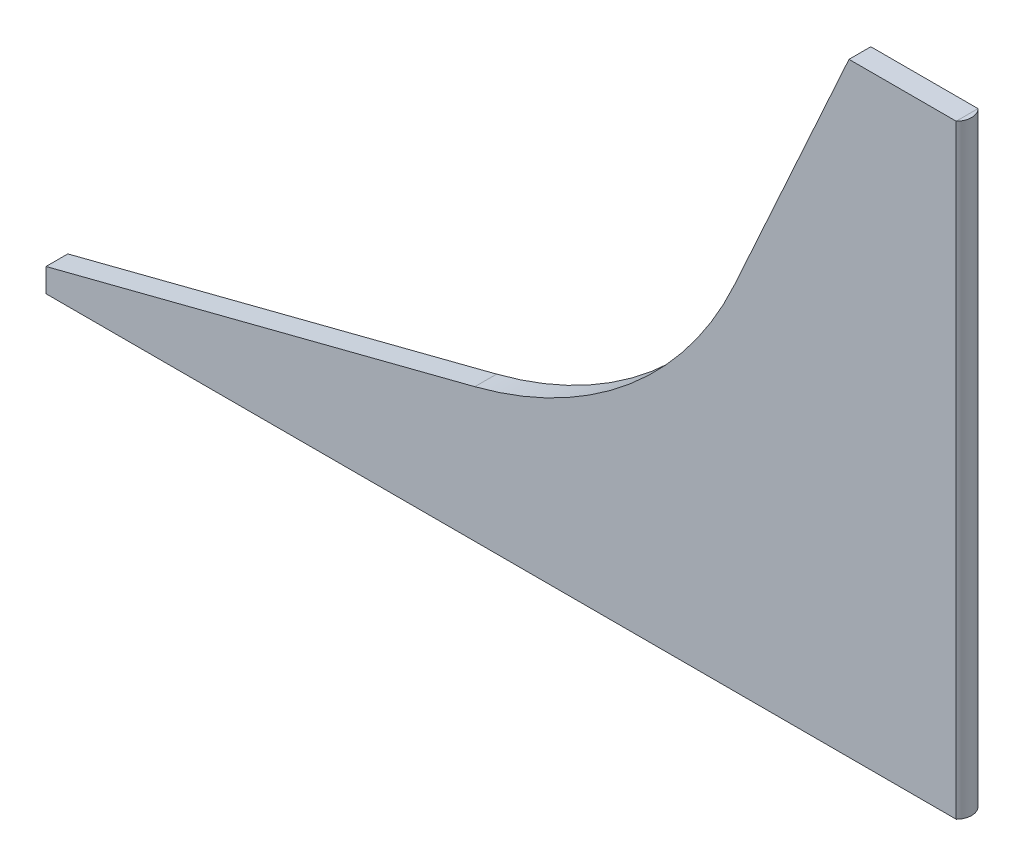
ISO-10303-21;
HEADER;
FILE_DESCRIPTION(('STEP AP214'),'2;1');
FILE_NAME('part.step','',(''),(''),'','','');
FILE_SCHEMA(('AUTOMOTIVE_DESIGN { 1 0 10303 214 1 1 1 1 }'));
ENDSEC;
DATA;
#1=APPLICATION_CONTEXT('core data for automotive mechanical design processes');
#2=APPLICATION_PROTOCOL_DEFINITION('international standard','automotive_design',2000,#1);
#3=PRODUCT_CONTEXT('',#1,'mechanical');
#4=PRODUCT('Part','Part','',(#3));
#5=PRODUCT_RELATED_PRODUCT_CATEGORY('part','',(#4));
#6=PRODUCT_DEFINITION_FORMATION('','',#4);
#7=PRODUCT_DEFINITION_CONTEXT('part definition',#1,'design');
#8=PRODUCT_DEFINITION('design','',#6,#7);
#9=PRODUCT_DEFINITION_SHAPE('','',#8);
#10=(LENGTH_UNIT() NAMED_UNIT(*) SI_UNIT(.MILLI.,.METRE.));
#11=(NAMED_UNIT(*) PLANE_ANGLE_UNIT() SI_UNIT($,.RADIAN.));
#12=(NAMED_UNIT(*) SI_UNIT($,.STERADIAN.) SOLID_ANGLE_UNIT());
#13=UNCERTAINTY_MEASURE_WITH_UNIT(LENGTH_MEASURE(1.E-05),#10,'distance_accuracy_value','');
#14=(GEOMETRIC_REPRESENTATION_CONTEXT(3) GLOBAL_UNCERTAINTY_ASSIGNED_CONTEXT((#13)) GLOBAL_UNIT_ASSIGNED_CONTEXT((#10,
#11,#12)) REPRESENTATION_CONTEXT('',''));
#15=CARTESIAN_POINT('',(0.,0.,0.));
#16=DIRECTION('',(0.,0.,1.));
#17=DIRECTION('',(1.,0.,0.));
#18=AXIS2_PLACEMENT_3D('',#15,#16,#17);
#19=CARTESIAN_POINT('',(316.193910951218,303.526867896713,7.5));
#20=DIRECTION('',(0.,-1.,0.));
#21=DIRECTION('',(0.,0.,-1.));
#22=AXIS2_PLACEMENT_3D('',#19,#20,#21);
#23=CYLINDRICAL_SURFACE('',#22,6.36396103067901);
#24=DIRECTION('',(0.,-1.,0.));
#25=VECTOR('',#24,1.);
#26=CARTESIAN_POINT('',(320.693910951218,303.526867896713,12.));
#27=LINE('',#26,#25);
#28=CARTESIAN_POINT('',(320.693910951218,303.526867896713,12.));
#29=VERTEX_POINT('',#28);
#30=CARTESIAN_POINT('',(320.693910951218,53.9268678967132,12.));
#31=VERTEX_POINT('',#30);
#32=EDGE_CURVE('E59',#29,#31,#27,.T.);
#33=ORIENTED_EDGE('',*,*,#32,.T.);
#34=CARTESIAN_POINT('',(316.193910951218,53.9268678967132,7.5));
#35=DIRECTION('',(0.,1.,0.));
#36=DIRECTION('',(0.,0.,-1.));
#37=AXIS2_PLACEMENT_3D('',#34,#35,#36);
#38=CIRCLE('',#37,6.36396103067901);
#39=CARTESIAN_POINT('',(320.693910951218,53.9268678967132,3.));
#40=VERTEX_POINT('',#39);
#41=EDGE_CURVE('E82',#31,#40,#38,.T.);
#42=ORIENTED_EDGE('',*,*,#41,.T.);
#43=DIRECTION('',(0.,-1.,0.));
#44=VECTOR('',#43,1.);
#45=CARTESIAN_POINT('',(320.693910951218,303.526867896713,3.));
#46=LINE('',#45,#44);
#47=CARTESIAN_POINT('',(320.693910951218,303.526867896713,3.));
#48=VERTEX_POINT('',#47);
#49=EDGE_CURVE('E12',#48,#40,#46,.T.);
#50=ORIENTED_EDGE('',*,*,#49,.F.);
#51=CARTESIAN_POINT('',(316.193910951218,303.526867896713,7.5));
#52=DIRECTION('',(0.,1.,0.));
#53=DIRECTION('',(0.,0.,-1.));
#54=AXIS2_PLACEMENT_3D('',#51,#52,#53);
#55=CIRCLE('',#54,6.36396103067901);
#56=EDGE_CURVE('E88',#29,#48,#55,.T.);
#57=ORIENTED_EDGE('',*,*,#56,.F.);
#58=EDGE_LOOP('',(#33,#42,#50,#57));
#59=FACE_BOUND('',#58,.T.);
#60=ADVANCED_FACE('F51',(#59),#23,.T.);
#61=CARTESIAN_POINT('',(320.693910951218,303.526867896713,3.));
#62=DIRECTION('',(1.,0.,0.));
#63=DIRECTION('',(0.,0.,-1.));
#64=AXIS2_PLACEMENT_3D('',#61,#62,#63);
#65=PLANE('',#64);
#66=ORIENTED_EDGE('',*,*,#49,.T.);
#67=DIRECTION('',(0.,0.,1.));
#68=VECTOR('',#67,1.);
#69=CARTESIAN_POINT('',(320.693910951218,53.9268678967132,3.));
#70=LINE('',#69,#68);
#71=EDGE_CURVE('E78',#40,#31,#70,.T.);
#72=ORIENTED_EDGE('',*,*,#71,.T.);
#73=ORIENTED_EDGE('',*,*,#32,.F.);
#74=DIRECTION('',(0.,0.,1.));
#75=VECTOR('',#74,1.);
#76=CARTESIAN_POINT('',(320.693910951218,303.526867896713,3.));
#77=LINE('',#76,#75);
#78=EDGE_CURVE('E65',#48,#29,#77,.T.);
#79=ORIENTED_EDGE('',*,*,#78,.F.);
#80=EDGE_LOOP('',(#66,#72,#73,#79));
#81=FACE_BOUND('',#80,.T.);
#82=ADVANCED_FACE('F76',(#81),#65,.F.);
#83=CARTESIAN_POINT('',(316.193910951218,303.526867896713,7.5));
#84=DIRECTION('',(0.,-1.,0.));
#85=DIRECTION('',(0.,0.,-1.));
#86=AXIS2_PLACEMENT_3D('',#83,#84,#85);
#87=PLANE('',#86);
#88=ORIENTED_EDGE('',*,*,#56,.T.);
#89=ORIENTED_EDGE('',*,*,#78,.T.);
#90=EDGE_LOOP('',(#88,#89));
#91=FACE_BOUND('',#90,.T.);
#92=ADVANCED_FACE('F95',(#91),#87,.F.);
#93=CARTESIAN_POINT('',(316.193910951218,53.9268678967132,7.5));
#94=DIRECTION('',(0.,-1.,0.));
#95=DIRECTION('',(0.,0.,-1.));
#96=AXIS2_PLACEMENT_3D('',#93,#94,#95);
#97=PLANE('',#96);
#98=ORIENTED_EDGE('',*,*,#41,.F.);
#99=ORIENTED_EDGE('',*,*,#71,.F.);
#100=EDGE_LOOP('',(#98,#99));
#101=FACE_BOUND('',#100,.T.);
#102=ADVANCED_FACE('F86',(#101),#97,.T.);
#103=CLOSED_SHELL('',(#60,#82,#92,#102));
#104=MANIFOLD_SOLID_BREP('B2',#103);
#105=CARTESIAN_POINT('',(320.693910951217,53.9268678967132,12.));
#106=DIRECTION('',(-1.,0.,0.));
#107=DIRECTION('',(0.,-1.,0.));
#108=AXIS2_PLACEMENT_3D('',#105,#106,#107);
#109=PLANE('',#108);
#110=DIRECTION('',(0.,1.,0.));
#111=VECTOR('',#110,1.);
#112=CARTESIAN_POINT('',(320.693910951217,53.9268678967132,3.));
#113=LINE('',#112,#111);
#114=CARTESIAN_POINT('',(320.693910951217,53.9268678967132,3.));
#115=VERTEX_POINT('',#114);
#116=CARTESIAN_POINT('',(320.693910951218,303.526867896713,3.));
#117=VERTEX_POINT('',#116);
#118=EDGE_CURVE('E227',#115,#117,#113,.T.);
#119=ORIENTED_EDGE('',*,*,#118,.T.);
#120=DIRECTION('',(0.,0.,-1.));
#121=VECTOR('',#120,1.);
#122=CARTESIAN_POINT('',(320.693910951218,303.526867896713,12.));
#123=LINE('',#122,#121);
#124=CARTESIAN_POINT('',(320.693910951218,303.526867896713,12.));
#125=VERTEX_POINT('',#124);
#126=EDGE_CURVE('E141',#125,#117,#123,.T.);
#127=ORIENTED_EDGE('',*,*,#126,.F.);
#128=DIRECTION('',(0.,1.,0.));
#129=VECTOR('',#128,1.);
#130=CARTESIAN_POINT('',(320.693910951217,53.9268678967132,12.));
#131=LINE('',#130,#129);
#132=CARTESIAN_POINT('',(320.693910951217,53.9268678967132,12.));
#133=VERTEX_POINT('',#132);
#134=EDGE_CURVE('E190',#133,#125,#131,.T.);
#135=ORIENTED_EDGE('',*,*,#134,.F.);
#136=DIRECTION('',(0.,0.,-1.));
#137=VECTOR('',#136,1.);
#138=CARTESIAN_POINT('',(320.693910951217,53.9268678967132,12.));
#139=LINE('',#138,#137);
#140=EDGE_CURVE('E49',#133,#115,#139,.T.);
#141=ORIENTED_EDGE('',*,*,#140,.T.);
#142=EDGE_LOOP('',(#119,#127,#135,#141));
#143=FACE_BOUND('',#142,.T.);
#144=ADVANCED_FACE('F133',(#143),#109,.F.);
#145=CARTESIAN_POINT('',(320.693910951218,303.526867896713,12.));
#146=DIRECTION('',(0.,-1.,0.));
#147=DIRECTION('',(0.,0.,-1.));
#148=AXIS2_PLACEMENT_3D('',#145,#146,#147);
#149=PLANE('',#148);
#150=DIRECTION('',(-1.,0.,0.));
#151=VECTOR('',#150,1.);
#152=CARTESIAN_POINT('',(320.693910951218,303.526867896713,3.));
#153=LINE('',#152,#151);
#154=CARTESIAN_POINT('',(276.442443442337,303.526867896713,3.));
#155=VERTEX_POINT('',#154);
#156=EDGE_CURVE('E229',#117,#155,#153,.T.);
#157=ORIENTED_EDGE('',*,*,#156,.T.);
#158=DIRECTION('',(0.,0.,-1.));
#159=VECTOR('',#158,1.);
#160=CARTESIAN_POINT('',(276.442443442337,303.526867896713,12.));
#161=LINE('',#160,#159);
#162=CARTESIAN_POINT('',(276.442443442337,303.526867896713,12.));
#163=VERTEX_POINT('',#162);
#164=EDGE_CURVE('E241',#163,#155,#161,.T.);
#165=ORIENTED_EDGE('',*,*,#164,.F.);
#166=DIRECTION('',(-1.,0.,0.));
#167=VECTOR('',#166,1.);
#168=CARTESIAN_POINT('',(320.693910951218,303.526867896713,12.));
#169=LINE('',#168,#167);
#170=EDGE_CURVE('E249',#125,#163,#169,.T.);
#171=ORIENTED_EDGE('',*,*,#170,.F.);
#172=ORIENTED_EDGE('',*,*,#126,.T.);
#173=EDGE_LOOP('',(#157,#165,#171,#172));
#174=FACE_BOUND('',#173,.T.);
#175=ADVANCED_FACE('F247',(#174),#149,.F.);
#176=CARTESIAN_POINT('',(276.442443442337,303.526867896713,12.));
#177=DIRECTION('',(0.910712499489341,-0.413040849400973,0.));
#178=DIRECTION('',(0.413040849400973,0.910712499489341,0.));
#179=AXIS2_PLACEMENT_3D('',#176,#177,#178);
#180=PLANE('',#179);
#181=DIRECTION('',(-0.413040849400973,-0.910712499489341,0.));
#182=VECTOR('',#181,1.);
#183=CARTESIAN_POINT('',(276.442443442337,303.526867896713,3.));
#184=LINE('',#183,#182);
#185=CARTESIAN_POINT('',(229.13261141598,199.213564654115,3.));
#186=VERTEX_POINT('',#185);
#187=EDGE_CURVE('E231',#155,#186,#184,.T.);
#188=ORIENTED_EDGE('',*,*,#187,.T.);
#189=DIRECTION('',(0.,0.,-1.));
#190=VECTOR('',#189,1.);
#191=CARTESIAN_POINT('',(229.13261141598,199.213564654115,12.));
#192=LINE('',#191,#190);
#193=CARTESIAN_POINT('',(229.13261141598,199.213564654115,12.));
#194=VERTEX_POINT('',#193);
#195=EDGE_CURVE('E216',#194,#186,#192,.T.);
#196=ORIENTED_EDGE('',*,*,#195,.F.);
#197=DIRECTION('',(-0.413040849400973,-0.910712499489341,0.));
#198=VECTOR('',#197,1.);
#199=CARTESIAN_POINT('',(276.442443442337,303.526867896713,12.));
#200=LINE('',#199,#198);
#201=EDGE_CURVE('E207',#163,#194,#200,.T.);
#202=ORIENTED_EDGE('',*,*,#201,.F.);
#203=ORIENTED_EDGE('',*,*,#164,.T.);
#204=EDGE_LOOP('',(#188,#196,#202,#203));
#205=FACE_BOUND('',#204,.T.);
#206=ADVANCED_FACE('F256',(#205),#180,.F.);
#207=CARTESIAN_POINT('',(81.5971864987071,266.126182257072,12.));
#208=DIRECTION('',(0.,0.,-1.));
#209=DIRECTION('',(-1.,0.,0.));
#210=AXIS2_PLACEMENT_3D('',#207,#208,#209);
#211=CYLINDRICAL_SURFACE('',#210,162.);
#212=CARTESIAN_POINT('',(81.5971864987071,266.126182257072,3.));
#213=DIRECTION('',(0.,0.,-1.));
#214=DIRECTION('',(-1.,0.,0.));
#215=AXIS2_PLACEMENT_3D('',#212,#213,#214);
#216=CIRCLE('',#215,162.);
#217=CARTESIAN_POINT('',(121.954142925945,109.233492599682,3.));
#218=VERTEX_POINT('',#217);
#219=EDGE_CURVE('E215',#186,#218,#216,.T.);
#220=ORIENTED_EDGE('',*,*,#219,.T.);
#221=DIRECTION('',(0.,0.,-1.));
#222=VECTOR('',#221,1.);
#223=CARTESIAN_POINT('',(121.954142925945,109.233492599682,12.));
#224=LINE('',#223,#222);
#225=CARTESIAN_POINT('',(121.954142925945,109.233492599682,12.));
#226=VERTEX_POINT('',#225);
#227=EDGE_CURVE('E212',#226,#218,#224,.T.);
#228=ORIENTED_EDGE('',*,*,#227,.F.);
#229=CARTESIAN_POINT('',(81.5971864987071,266.126182257072,12.));
#230=DIRECTION('',(0.,0.,-1.));
#231=DIRECTION('',(-1.,0.,0.));
#232=AXIS2_PLACEMENT_3D('',#229,#230,#231);
#233=CIRCLE('',#232,162.);
#234=EDGE_CURVE('E201',#194,#226,#233,.T.);
#235=ORIENTED_EDGE('',*,*,#234,.F.);
#236=ORIENTED_EDGE('',*,*,#195,.T.);
#237=EDGE_LOOP('',(#220,#228,#235,#236));
#238=FACE_BOUND('',#237,.T.);
#239=ADVANCED_FACE('F213',(#238),#211,.F.);
#240=CARTESIAN_POINT('',(121.954142925945,109.233492599682,12.));
#241=DIRECTION('',(0.24911701498295,-0.96847339294685,0.));
#242=DIRECTION('',(0.968473392946851,0.24911701498295,0.));
#243=AXIS2_PLACEMENT_3D('',#240,#241,#242);
#244=PLANE('',#243);
#245=DIRECTION('',(-0.968473392946851,-0.24911701498295,0.));
#246=VECTOR('',#245,1.);
#247=CARTESIAN_POINT('',(121.954142925945,109.233492599682,3.));
#248=LINE('',#247,#246);
#249=CARTESIAN_POINT('',(-55.0948685123736,63.6917961974804,3.));
#250=VERTEX_POINT('',#249);
#251=EDGE_CURVE('E176',#218,#250,#248,.T.);
#252=ORIENTED_EDGE('',*,*,#251,.T.);
#253=DIRECTION('',(0.,0.,-1.));
#254=VECTOR('',#253,1.);
#255=CARTESIAN_POINT('',(-55.0948685123736,63.6917961974804,12.));
#256=LINE('',#255,#254);
#257=CARTESIAN_POINT('',(-55.0948685123736,63.6917961974804,12.));
#258=VERTEX_POINT('',#257);
#259=EDGE_CURVE('E217',#258,#250,#256,.T.);
#260=ORIENTED_EDGE('',*,*,#259,.F.);
#261=DIRECTION('',(-0.968473392946851,-0.24911701498295,0.));
#262=VECTOR('',#261,1.);
#263=CARTESIAN_POINT('',(121.954142925945,109.233492599682,12.));
#264=LINE('',#263,#262);
#265=EDGE_CURVE('E205',#226,#258,#264,.T.);
#266=ORIENTED_EDGE('',*,*,#265,.F.);
#267=ORIENTED_EDGE('',*,*,#227,.T.);
#268=EDGE_LOOP('',(#252,#260,#266,#267));
#269=FACE_BOUND('',#268,.T.);
#270=ADVANCED_FACE('F219',(#269),#244,.F.);
#271=CARTESIAN_POINT('',(-55.0948685123736,63.6917961974804,12.));
#272=DIRECTION('',(1.,0.,0.));
#273=DIRECTION('',(0.,0.,-1.));
#274=AXIS2_PLACEMENT_3D('',#271,#272,#273);
#275=PLANE('',#274);
#276=DIRECTION('',(0.,-1.,0.));
#277=VECTOR('',#276,1.);
#278=CARTESIAN_POINT('',(-55.0948685123736,63.6917961974804,3.));
#279=LINE('',#278,#277);
#280=CARTESIAN_POINT('',(-55.0948685123736,53.9268678967145,3.));
#281=VERTEX_POINT('',#280);
#282=EDGE_CURVE('E183',#250,#281,#279,.T.);
#283=ORIENTED_EDGE('',*,*,#282,.T.);
#284=DIRECTION('',(0.,0.,-1.));
#285=VECTOR('',#284,1.);
#286=CARTESIAN_POINT('',(-55.0948685123736,53.9268678967145,12.));
#287=LINE('',#286,#285);
#288=CARTESIAN_POINT('',(-55.0948685123736,53.9268678967145,12.));
#289=VERTEX_POINT('',#288);
#290=EDGE_CURVE('E223',#289,#281,#287,.T.);
#291=ORIENTED_EDGE('',*,*,#290,.F.);
#292=DIRECTION('',(0.,-1.,0.));
#293=VECTOR('',#292,1.);
#294=CARTESIAN_POINT('',(-55.0948685123736,63.6917961974804,12.));
#295=LINE('',#294,#293);
#296=EDGE_CURVE('E221',#258,#289,#295,.T.);
#297=ORIENTED_EDGE('',*,*,#296,.F.);
#298=ORIENTED_EDGE('',*,*,#259,.T.);
#299=EDGE_LOOP('',(#283,#291,#297,#298));
#300=FACE_BOUND('',#299,.T.);
#301=ADVANCED_FACE('F274',(#300),#275,.F.);
#302=CARTESIAN_POINT('',(-55.0948685123736,53.9268678967145,12.));
#303=DIRECTION('',(0.,1.,0.));
#304=DIRECTION('',(-1.,0.,0.));
#305=AXIS2_PLACEMENT_3D('',#302,#303,#304);
#306=PLANE('',#305);
#307=DIRECTION('',(1.,0.,0.));
#308=VECTOR('',#307,1.);
#309=CARTESIAN_POINT('',(-55.0948685123736,53.9268678967145,3.));
#310=LINE('',#309,#308);
#311=EDGE_CURVE('E236',#281,#115,#310,.T.);
#312=ORIENTED_EDGE('',*,*,#311,.T.);
#313=ORIENTED_EDGE('',*,*,#140,.F.);
#314=DIRECTION('',(1.,0.,0.));
#315=VECTOR('',#314,1.);
#316=CARTESIAN_POINT('',(86.942757685206,53.926867896714,12.));
#317=LINE('',#316,#315);
#318=EDGE_CURVE('E149',#289,#133,#317,.T.);
#319=ORIENTED_EDGE('',*,*,#318,.F.);
#320=ORIENTED_EDGE('',*,*,#290,.T.);
#321=EDGE_LOOP('',(#312,#313,#319,#320));
#322=FACE_BOUND('',#321,.T.);
#323=ADVANCED_FACE('F260',(#322),#306,.F.);
#324=CARTESIAN_POINT('',(81.5971864987071,266.126182257072,12.));
#325=DIRECTION('',(0.,0.,-1.));
#326=DIRECTION('',(-1.,0.,0.));
#327=AXIS2_PLACEMENT_3D('',#324,#325,#326);
#328=PLANE('',#327);
#329=ORIENTED_EDGE('',*,*,#318,.T.);
#330=ORIENTED_EDGE('',*,*,#134,.T.);
#331=ORIENTED_EDGE('',*,*,#170,.T.);
#332=ORIENTED_EDGE('',*,*,#201,.T.);
#333=ORIENTED_EDGE('',*,*,#234,.T.);
#334=ORIENTED_EDGE('',*,*,#265,.T.);
#335=ORIENTED_EDGE('',*,*,#296,.T.);
#336=EDGE_LOOP('',(#329,#330,#331,#332,#333,#334,#335));
#337=FACE_BOUND('',#336,.T.);
#338=ADVANCED_FACE('F203',(#337),#328,.F.);
#339=CARTESIAN_POINT('',(81.5971864987071,266.126182257072,3.));
#340=DIRECTION('',(0.,0.,-1.));
#341=DIRECTION('',(-1.,0.,0.));
#342=AXIS2_PLACEMENT_3D('',#339,#340,#341);
#343=PLANE('',#342);
#344=ORIENTED_EDGE('',*,*,#118,.F.);
#345=ORIENTED_EDGE('',*,*,#311,.F.);
#346=ORIENTED_EDGE('',*,*,#282,.F.);
#347=ORIENTED_EDGE('',*,*,#251,.F.);
#348=ORIENTED_EDGE('',*,*,#219,.F.);
#349=ORIENTED_EDGE('',*,*,#187,.F.);
#350=ORIENTED_EDGE('',*,*,#156,.F.);
#351=EDGE_LOOP('',(#344,#345,#346,#347,#348,#349,#350));
#352=FACE_BOUND('',#351,.T.);
#353=ADVANCED_FACE('F253',(#352),#343,.T.);
#354=CLOSED_SHELL('',(#144,#175,#206,#239,#270,#301,#323,#338,#353));
#355=MANIFOLD_SOLID_BREP('B6',#354);
#356=ADVANCED_BREP_SHAPE_REPRESENTATION('',(#18,#104,#355),#14);
#357=SHAPE_DEFINITION_REPRESENTATION(#9,#356);
ENDSEC;
END-ISO-10303-21;
